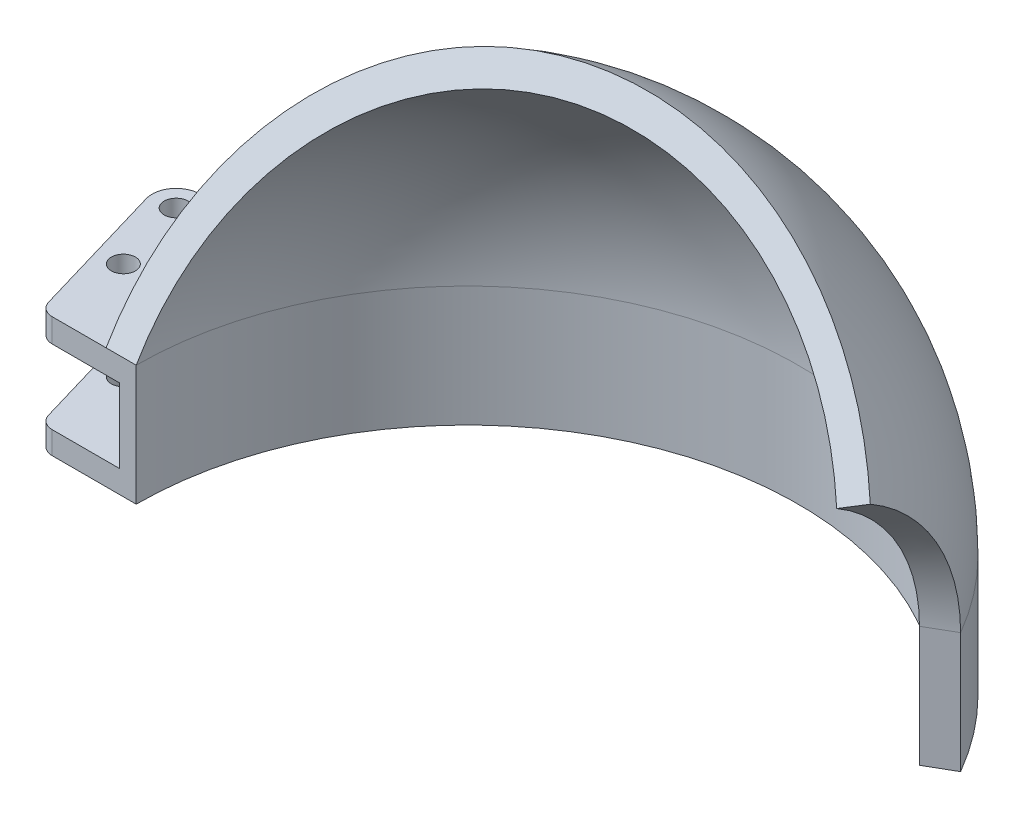
ISO-10303-21;
HEADER;
FILE_DESCRIPTION(('STEP AP214'),'2;1');
FILE_NAME('part.step','',(''),(''),'','','');
FILE_SCHEMA(('AUTOMOTIVE_DESIGN { 1 0 10303 214 1 1 1 1 }'));
ENDSEC;
DATA;
#1=APPLICATION_CONTEXT('core data for automotive mechanical design processes');
#2=APPLICATION_PROTOCOL_DEFINITION('international standard','automotive_design',2000,#1);
#3=PRODUCT_CONTEXT('',#1,'mechanical');
#4=PRODUCT('Part','Part','',(#3));
#5=PRODUCT_RELATED_PRODUCT_CATEGORY('part','',(#4));
#6=PRODUCT_DEFINITION_FORMATION('','',#4);
#7=PRODUCT_DEFINITION_CONTEXT('part definition',#1,'design');
#8=PRODUCT_DEFINITION('design','',#6,#7);
#9=PRODUCT_DEFINITION_SHAPE('','',#8);
#10=(LENGTH_UNIT() NAMED_UNIT(*) SI_UNIT(.MILLI.,.METRE.));
#11=(NAMED_UNIT(*) PLANE_ANGLE_UNIT() SI_UNIT($,.RADIAN.));
#12=(NAMED_UNIT(*) SI_UNIT($,.STERADIAN.) SOLID_ANGLE_UNIT());
#13=UNCERTAINTY_MEASURE_WITH_UNIT(LENGTH_MEASURE(1.E-05),#10,'distance_accuracy_value','');
#14=(GEOMETRIC_REPRESENTATION_CONTEXT(3) GLOBAL_UNCERTAINTY_ASSIGNED_CONTEXT((#13)) GLOBAL_UNIT_ASSIGNED_CONTEXT((#10,
#11,#12)) REPRESENTATION_CONTEXT('',''));
#15=CARTESIAN_POINT('',(0.,0.,0.));
#16=DIRECTION('',(0.,0.,1.));
#17=DIRECTION('',(1.,0.,0.));
#18=AXIS2_PLACEMENT_3D('',#15,#16,#17);
#19=CARTESIAN_POINT('',(-90.8718083904622,48.4997111829199,62.4645525043412));
#20=DIRECTION('',(0.959186051498703,0.,-0.282775739076619));
#21=DIRECTION('',(-0.282775739076619,0.,-0.959186051498703));
#22=AXIS2_PLACEMENT_3D('',#19,#20,#21);
#23=PLANE('',#22);
#24=DIRECTION('',(0.282775739076619,0.,0.959186051498703));
#25=VECTOR('',#24,1.);
#26=CARTESIAN_POINT('',(-100.548050523299,80.6356119656842,29.6423715242877));
#27=LINE('',#26,#25);
#28=CARTESIAN_POINT('',(-90.8718083904623,80.6356119656842,62.4645525043412));
#29=VERTEX_POINT('',#28);
#30=CARTESIAN_POINT('',(-77.3042502359662,80.6356119656842,108.486225287111));
#31=VERTEX_POINT('',#30);
#32=EDGE_CURVE('E252',#29,#31,#27,.T.);
#33=ORIENTED_EDGE('',*,*,#32,.T.);
#34=DIRECTION('',(0.,-1.,0.));
#35=VECTOR('',#34,1.);
#36=CARTESIAN_POINT('',(-77.3042502359661,48.4997111829199,108.486225287111));
#37=LINE('',#36,#35);
#38=CARTESIAN_POINT('',(-77.3042502359661,88.4997111829199,108.486225287111));
#39=VERTEX_POINT('',#38);
#40=EDGE_CURVE('E197',#39,#31,#37,.T.);
#41=ORIENTED_EDGE('',*,*,#40,.F.);
#42=DIRECTION('',(0.282775739076619,0.,0.959186051498703));
#43=VECTOR('',#42,1.);
#44=CARTESIAN_POINT('',(-100.548050523299,88.4997111829199,29.6423715242877));
#45=LINE('',#44,#43);
#46=CARTESIAN_POINT('',(-90.8718083904622,88.4997111829199,62.4645525043412));
#47=VERTEX_POINT('',#46);
#48=EDGE_CURVE('E145',#47,#39,#45,.T.);
#49=ORIENTED_EDGE('',*,*,#48,.F.);
#50=DIRECTION('',(0.,-1.,0.));
#51=VECTOR('',#50,1.);
#52=CARTESIAN_POINT('',(-90.8718083904622,48.4997111829199,62.4645525043412));
#53=LINE('',#52,#51);
#54=EDGE_CURVE('E179',#47,#29,#53,.T.);
#55=ORIENTED_EDGE('',*,*,#54,.T.);
#56=EDGE_LOOP('',(#33,#41,#49,#55));
#57=FACE_BOUND('',#56,.T.);
#58=ADVANCED_FACE('F49',(#57),#23,.F.);
#59=CARTESIAN_POINT('',(-72.5083199784726,48.4997111829199,107.072346591728));
#60=DIRECTION('',(0.,-1.,0.));
#61=DIRECTION('',(0.,0.,-1.));
#62=AXIS2_PLACEMENT_3D('',#59,#60,#61);
#63=CYLINDRICAL_SURFACE('',#62,5.);
#64=CARTESIAN_POINT('',(-72.5083199784726,80.6356119656842,107.072346591728));
#65=DIRECTION('',(0.,-1.,0.));
#66=DIRECTION('',(0.,0.,-1.));
#67=AXIS2_PLACEMENT_3D('',#64,#65,#66);
#68=CIRCLE('',#67,5.);
#69=CARTESIAN_POINT('',(-72.5083199784726,80.6356119656842,112.072346591728));
#70=VERTEX_POINT('',#69);
#71=EDGE_CURVE('E127',#70,#31,#68,.T.);
#72=ORIENTED_EDGE('',*,*,#71,.F.);
#73=DIRECTION('',(0.,-1.,0.));
#74=VECTOR('',#73,1.);
#75=CARTESIAN_POINT('',(-72.5083199784726,48.4997111829199,112.072346591728));
#76=LINE('',#75,#74);
#77=CARTESIAN_POINT('',(-72.5083199784726,88.4997111829199,112.072346591728));
#78=VERTEX_POINT('',#77);
#79=EDGE_CURVE('E120',#78,#70,#76,.T.);
#80=ORIENTED_EDGE('',*,*,#79,.F.);
#81=CARTESIAN_POINT('',(-72.5083199784726,88.4997111829199,107.072346591728));
#82=DIRECTION('',(0.,1.,0.));
#83=DIRECTION('',(0.,0.,1.));
#84=AXIS2_PLACEMENT_3D('',#81,#82,#83);
#85=CIRCLE('',#84,5.);
#86=EDGE_CURVE('E124',#39,#78,#85,.T.);
#87=ORIENTED_EDGE('',*,*,#86,.F.);
#88=ORIENTED_EDGE('',*,*,#40,.T.);
#89=EDGE_LOOP('',(#72,#80,#87,#88));
#90=FACE_BOUND('',#89,.T.);
#91=ADVANCED_FACE('F122',(#90),#63,.T.);
#92=CARTESIAN_POINT('',(-83.1983199784726,48.4997111829199,60.2023465917282));
#93=DIRECTION('',(0.,-1.,0.));
#94=DIRECTION('',(0.,0.,-1.));
#95=AXIS2_PLACEMENT_3D('',#92,#93,#94);
#96=CYLINDRICAL_SURFACE('',#95,4.);
#97=CARTESIAN_POINT('',(-83.1983199784726,88.4997111829199,60.2023465917282));
#98=DIRECTION('',(0.,1.,0.));
#99=DIRECTION('',(0.,0.,1.));
#100=AXIS2_PLACEMENT_3D('',#97,#98,#99);
#101=CIRCLE('',#100,4.);
#102=CARTESIAN_POINT('',(-83.1983199784726,88.4997111829199,64.2023465917282));
#103=VERTEX_POINT('',#102);
#104=EDGE_CURVE('E155',#103,#103,#101,.F.);
#105=ORIENTED_EDGE('',*,*,#104,.F.);
#106=EDGE_LOOP('',(#105));
#107=FACE_BOUND('',#106,.T.);
#108=CARTESIAN_POINT('',(-83.1983199784726,80.6356119656842,60.2023465917282));
#109=DIRECTION('',(0.,-1.,0.));
#110=DIRECTION('',(0.,0.,-1.));
#111=AXIS2_PLACEMENT_3D('',#108,#109,#110);
#112=CIRCLE('',#111,4.);
#113=CARTESIAN_POINT('',(-83.1983199784726,80.6356119656842,56.2023465917282));
#114=VERTEX_POINT('',#113);
#115=EDGE_CURVE('E287',#114,#114,#112,.T.);
#116=ORIENTED_EDGE('',*,*,#115,.T.);
#117=EDGE_LOOP('',(#116));
#118=FACE_BOUND('',#117,.T.);
#119=ADVANCED_FACE('F385',(#107,#118),#96,.F.);
#120=CARTESIAN_POINT('',(-75.8683199784726,48.4997111829199,85.0723465917282));
#121=DIRECTION('',(0.,-1.,0.));
#122=DIRECTION('',(0.,0.,-1.));
#123=AXIS2_PLACEMENT_3D('',#120,#121,#122);
#124=CYLINDRICAL_SURFACE('',#123,4.);
#125=CARTESIAN_POINT('',(-75.8683199784726,88.4997111829199,85.0723465917282));
#126=DIRECTION('',(0.,1.,0.));
#127=DIRECTION('',(0.,0.,1.));
#128=AXIS2_PLACEMENT_3D('',#125,#126,#127);
#129=CIRCLE('',#128,4.);
#130=CARTESIAN_POINT('',(-75.8683199784726,88.4997111829199,89.0723465917282));
#131=VERTEX_POINT('',#130);
#132=EDGE_CURVE('E162',#131,#131,#129,.F.);
#133=ORIENTED_EDGE('',*,*,#132,.F.);
#134=EDGE_LOOP('',(#133));
#135=FACE_BOUND('',#134,.T.);
#136=CARTESIAN_POINT('',(-75.8683199784726,80.6356119656842,85.0723465917282));
#137=DIRECTION('',(0.,-1.,0.));
#138=DIRECTION('',(0.,0.,-1.));
#139=AXIS2_PLACEMENT_3D('',#136,#137,#138);
#140=CIRCLE('',#139,4.);
#141=CARTESIAN_POINT('',(-75.8683199784726,80.6356119656842,81.0723465917282));
#142=VERTEX_POINT('',#141);
#143=EDGE_CURVE('E283',#142,#142,#140,.T.);
#144=ORIENTED_EDGE('',*,*,#143,.T.);
#145=EDGE_LOOP('',(#144));
#146=FACE_BOUND('',#145,.T.);
#147=ADVANCED_FACE('F402',(#135,#146),#124,.F.);
#148=CARTESIAN_POINT('',(-83.1983199784726,48.4997111829199,60.2023465917282));
#149=DIRECTION('',(0.,-1.,0.));
#150=DIRECTION('',(0.,0.,-1.));
#151=AXIS2_PLACEMENT_3D('',#148,#149,#150);
#152=CYLINDRICAL_SURFACE('',#151,8.);
#153=CARTESIAN_POINT('',(-83.1983199784726,80.6356119656842,60.2023465917282));
#154=DIRECTION('',(0.,-1.,0.));
#155=DIRECTION('',(0.,0.,-1.));
#156=AXIS2_PLACEMENT_3D('',#153,#154,#155);
#157=CIRCLE('',#156,8.);
#158=CARTESIAN_POINT('',(-80.4349878468603,80.6356119656842,52.6947507361697));
#159=VERTEX_POINT('',#158);
#160=EDGE_CURVE('E223',#29,#159,#157,.T.);
#161=ORIENTED_EDGE('',*,*,#160,.F.);
#162=ORIENTED_EDGE('',*,*,#54,.F.);
#163=CARTESIAN_POINT('',(-83.1983199784726,88.4997111829199,60.2023465917282));
#164=DIRECTION('',(0.,1.,0.));
#165=DIRECTION('',(0.,0.,1.));
#166=AXIS2_PLACEMENT_3D('',#163,#164,#165);
#167=CIRCLE('',#166,8.);
#168=CARTESIAN_POINT('',(-80.4349878468602,88.4997111829199,52.6947507361698));
#169=VERTEX_POINT('',#168);
#170=EDGE_CURVE('E326',#169,#47,#167,.T.);
#171=ORIENTED_EDGE('',*,*,#170,.F.);
#172=DIRECTION('',(0.,-1.,0.));
#173=VECTOR('',#172,1.);
#174=CARTESIAN_POINT('',(-80.4349878468602,48.4997111829199,52.6947507361698));
#175=LINE('',#174,#173);
#176=EDGE_CURVE('E193',#169,#159,#175,.T.);
#177=ORIENTED_EDGE('',*,*,#176,.T.);
#178=EDGE_LOOP('',(#161,#162,#171,#177));
#179=FACE_BOUND('',#178,.T.);
#180=ADVANCED_FACE('F409',(#179),#152,.T.);
#181=CARTESIAN_POINT('',(-72.5083199784726,48.4997111829199,112.072346591728));
#182=DIRECTION('',(0.,0.,-1.));
#183=DIRECTION('',(-1.,0.,0.));
#184=AXIS2_PLACEMENT_3D('',#181,#182,#183);
#185=PLANE('',#184);
#186=DIRECTION('',(-1.,0.,0.));
#187=VECTOR('',#186,1.);
#188=CARTESIAN_POINT('',(-72.5083199784726,80.6356119656842,112.072346591728));
#189=LINE('',#188,#187);
#190=CARTESIAN_POINT('',(-50.1832677511967,80.6356119656842,112.072346591728));
#191=VERTEX_POINT('',#190);
#192=EDGE_CURVE('E278',#191,#70,#189,.T.);
#193=ORIENTED_EDGE('',*,*,#192,.F.);
#194=DIRECTION('',(0.,1.,0.));
#195=VECTOR('',#194,1.);
#196=CARTESIAN_POINT('',(-50.1832677511968,48.4997111829199,112.072346591728));
#197=LINE('',#196,#195);
#198=CARTESIAN_POINT('',(-50.1832677511967,55.9997111829199,112.072346591728));
#199=VERTEX_POINT('',#198);
#200=EDGE_CURVE('E242',#199,#191,#197,.T.);
#201=ORIENTED_EDGE('',*,*,#200,.F.);
#202=DIRECTION('',(-1.,0.,0.));
#203=VECTOR('',#202,1.);
#204=CARTESIAN_POINT('',(-72.5083199784726,55.9997111829199,112.072346591728));
#205=LINE('',#204,#203);
#206=CARTESIAN_POINT('',(-72.5083199784726,55.9997111829199,112.072346591728));
#207=VERTEX_POINT('',#206);
#208=EDGE_CURVE('E240',#199,#207,#205,.T.);
#209=ORIENTED_EDGE('',*,*,#208,.T.);
#210=CARTESIAN_POINT('',(-72.5083199784726,48.4997111829199,112.072346591728));
#211=VERTEX_POINT('',#210);
#212=EDGE_CURVE('E133',#207,#211,#76,.T.);
#213=ORIENTED_EDGE('',*,*,#212,.T.);
#214=DIRECTION('',(-1.,0.,0.));
#215=VECTOR('',#214,1.);
#216=CARTESIAN_POINT('',(-44.6131129359855,48.4997111829199,112.072346591728));
#217=LINE('',#216,#215);
#218=CARTESIAN_POINT('',(-44.6131129359855,48.4997111829199,112.072346591728));
#219=VERTEX_POINT('',#218);
#220=EDGE_CURVE('E298',#219,#211,#217,.T.);
#221=ORIENTED_EDGE('',*,*,#220,.F.);
#222=DIRECTION('',(0.,-1.,0.));
#223=VECTOR('',#222,1.);
#224=CARTESIAN_POINT('',(-44.6131129359855,88.4997111829199,112.072346591728));
#225=LINE('',#224,#223);
#226=CARTESIAN_POINT('',(-44.6131129359855,88.4997111829199,112.072346591728));
#227=VERTEX_POINT('',#226);
#228=EDGE_CURVE('E182',#227,#219,#225,.T.);
#229=ORIENTED_EDGE('',*,*,#228,.F.);
#230=DIRECTION('',(1.,0.,0.));
#231=VECTOR('',#230,1.);
#232=CARTESIAN_POINT('',(0.,88.4997111829199,112.072346591728));
#233=LINE('',#232,#231);
#234=CARTESIAN_POINT('',(-54.6131129359855,88.4997111829199,112.072346591728));
#235=VERTEX_POINT('',#234);
#236=EDGE_CURVE('E150',#235,#227,#233,.T.);
#237=ORIENTED_EDGE('',*,*,#236,.F.);
#238=DIRECTION('',(1.,0.,0.));
#239=VECTOR('',#238,1.);
#240=CARTESIAN_POINT('',(0.,88.4997111829199,112.072346591728));
#241=LINE('',#240,#239);
#242=EDGE_CURVE('E141',#78,#235,#241,.T.);
#243=ORIENTED_EDGE('',*,*,#242,.F.);
#244=ORIENTED_EDGE('',*,*,#79,.T.);
#245=EDGE_LOOP('',(#193,#201,#209,#213,#221,#229,#237,#243,#244));
#246=FACE_BOUND('',#245,.T.);
#247=ADVANCED_FACE('F148',(#246),#185,.F.);
#248=CARTESIAN_POINT('',(37.7087626037851,48.4997111829199,96.1800991820042));
#249=DIRECTION('',(-0.345416516451547,0.,0.938449481944808));
#250=DIRECTION('',(0.938449481944808,0.,0.345416516451547));
#251=AXIS2_PLACEMENT_3D('',#248,#249,#250);
#252=PLANE('',#251);
#253=DIRECTION('',(0.938449481944808,0.,0.345416516451547));
#254=VECTOR('',#253,1.);
#255=CARTESIAN_POINT('',(37.7087626037851,80.6356119656842,96.1800991820042));
#256=LINE('',#255,#254);
#257=CARTESIAN_POINT('',(-66.1367512945611,80.6356119656842,57.957524232576));
#258=VERTEX_POINT('',#257);
#259=EDGE_CURVE('E53',#159,#258,#256,.T.);
#260=ORIENTED_EDGE('',*,*,#259,.F.);
#261=ORIENTED_EDGE('',*,*,#176,.F.);
#262=DIRECTION('',(-0.938449481944808,0.,-0.345416516451547));
#263=VECTOR('',#262,1.);
#264=CARTESIAN_POINT('',(-26.6782221381886,88.4997111829199,72.4810845815577));
#265=LINE('',#264,#263);
#266=CARTESIAN_POINT('',(-45.2657064055788,88.4997111829199,65.6395612084141));
#267=VERTEX_POINT('',#266);
#268=EDGE_CURVE('E322',#267,#169,#265,.T.);
#269=ORIENTED_EDGE('',*,*,#268,.F.);
#270=DIRECTION('',(0.,-1.,0.));
#271=VECTOR('',#270,1.);
#272=CARTESIAN_POINT('',(-45.2657064055788,88.4997111829199,65.6395612084141));
#273=LINE('',#272,#271);
#274=CARTESIAN_POINT('',(-45.2657064055788,48.4997111829199,65.6395612084141));
#275=VERTEX_POINT('',#274);
#276=EDGE_CURVE('E185',#267,#275,#273,.T.);
#277=ORIENTED_EDGE('',*,*,#276,.T.);
#278=DIRECTION('',(0.938449481944808,0.,0.345416516451547));
#279=VECTOR('',#278,1.);
#280=CARTESIAN_POINT('',(-80.4349878468602,48.4997111829199,52.6947507361697));
#281=LINE('',#280,#279);
#282=CARTESIAN_POINT('',(-80.4349878468602,48.4997111829199,52.6947507361697));
#283=VERTEX_POINT('',#282);
#284=EDGE_CURVE('E295',#283,#275,#281,.T.);
#285=ORIENTED_EDGE('',*,*,#284,.F.);
#286=CARTESIAN_POINT('',(-80.4349878468603,55.9997111829199,52.6947507361697));
#287=VERTEX_POINT('',#286);
#288=EDGE_CURVE('E192',#287,#283,#175,.T.);
#289=ORIENTED_EDGE('',*,*,#288,.F.);
#290=DIRECTION('',(0.938449481944808,0.,0.345416516451547));
#291=VECTOR('',#290,1.);
#292=CARTESIAN_POINT('',(37.7087626037851,55.9997111829199,96.1800991820042));
#293=LINE('',#292,#291);
#294=CARTESIAN_POINT('',(-66.1367512945611,55.9997111829199,57.957524232576));
#295=VERTEX_POINT('',#294);
#296=EDGE_CURVE('E205',#287,#295,#293,.T.);
#297=ORIENTED_EDGE('',*,*,#296,.T.);
#298=DIRECTION('',(0.,-1.,0.));
#299=VECTOR('',#298,1.);
#300=CARTESIAN_POINT('',(-66.1367512945611,48.4997111829199,57.957524232576));
#301=LINE('',#300,#299);
#302=EDGE_CURVE('E178',#258,#295,#301,.T.);
#303=ORIENTED_EDGE('',*,*,#302,.F.);
#304=EDGE_LOOP('',(#260,#261,#269,#277,#285,#289,#297,#303));
#305=FACE_BOUND('',#304,.T.);
#306=ADVANCED_FACE('F224',(#305),#252,.F.);
#307=CARTESIAN_POINT('',(-77.3042502359662,55.9997111829199,108.486225287111));
#308=VERTEX_POINT('',#307);
#309=CARTESIAN_POINT('',(-77.3042502359661,48.4997111829199,108.486225287111));
#310=VERTEX_POINT('',#309);
#311=EDGE_CURVE('E132',#308,#310,#37,.T.);
#312=ORIENTED_EDGE('',*,*,#311,.F.);
#313=DIRECTION('',(0.282775739076619,0.,0.959186051498703));
#314=VECTOR('',#313,1.);
#315=CARTESIAN_POINT('',(-100.548050523299,55.9997111829199,29.6423715242877));
#316=LINE('',#315,#314);
#317=CARTESIAN_POINT('',(-90.8718083904623,55.9997111829199,62.4645525043412));
#318=VERTEX_POINT('',#317);
#319=EDGE_CURVE('E248',#318,#308,#316,.T.);
#320=ORIENTED_EDGE('',*,*,#319,.F.);
#321=CARTESIAN_POINT('',(-90.8718083904622,48.4997111829199,62.4645525043412));
#322=VERTEX_POINT('',#321);
#323=EDGE_CURVE('E200',#318,#322,#53,.T.);
#324=ORIENTED_EDGE('',*,*,#323,.T.);
#325=DIRECTION('',(-0.282775739076619,0.,-0.959186051498703));
#326=VECTOR('',#325,1.);
#327=CARTESIAN_POINT('',(-77.3042502359661,48.4997111829199,108.486225287111));
#328=LINE('',#327,#326);
#329=EDGE_CURVE('E306',#310,#322,#328,.T.);
#330=ORIENTED_EDGE('',*,*,#329,.F.);
#331=EDGE_LOOP('',(#312,#320,#324,#330));
#332=FACE_BOUND('',#331,.T.);
#333=ADVANCED_FACE('F359',(#332),#23,.F.);
#334=ORIENTED_EDGE('',*,*,#212,.F.);
#335=CARTESIAN_POINT('',(-72.5083199784726,55.9997111829199,107.072346591728));
#336=DIRECTION('',(0.,-1.,0.));
#337=DIRECTION('',(0.,0.,-1.));
#338=AXIS2_PLACEMENT_3D('',#335,#336,#337);
#339=CIRCLE('',#338,5.);
#340=EDGE_CURVE('E264',#207,#308,#339,.T.);
#341=ORIENTED_EDGE('',*,*,#340,.T.);
#342=ORIENTED_EDGE('',*,*,#311,.T.);
#343=CARTESIAN_POINT('',(-72.5083199784726,48.4997111829199,107.072346591728));
#344=DIRECTION('',(0.,-1.,0.));
#345=DIRECTION('',(0.,0.,-1.));
#346=AXIS2_PLACEMENT_3D('',#343,#344,#345);
#347=CIRCLE('',#346,5.00000000000001);
#348=EDGE_CURVE('E302',#211,#310,#347,.T.);
#349=ORIENTED_EDGE('',*,*,#348,.F.);
#350=EDGE_LOOP('',(#334,#341,#342,#349));
#351=FACE_BOUND('',#350,.T.);
#352=ADVANCED_FACE('F374',(#351),#63,.T.);
#353=CARTESIAN_POINT('',(-83.1983199784726,55.9997111829199,60.2023465917282));
#354=DIRECTION('',(0.,-1.,0.));
#355=DIRECTION('',(0.,0.,-1.));
#356=AXIS2_PLACEMENT_3D('',#353,#354,#355);
#357=CIRCLE('',#356,4.);
#358=CARTESIAN_POINT('',(-83.1983199784726,55.9997111829199,56.2023465917282));
#359=VERTEX_POINT('',#358);
#360=EDGE_CURVE('E272',#359,#359,#357,.T.);
#361=ORIENTED_EDGE('',*,*,#360,.F.);
#362=EDGE_LOOP('',(#361));
#363=FACE_BOUND('',#362,.T.);
#364=CARTESIAN_POINT('',(-83.1983199784726,48.4997111829199,60.2023465917282));
#365=DIRECTION('',(0.,-1.,0.));
#366=DIRECTION('',(0.,0.,-1.));
#367=AXIS2_PLACEMENT_3D('',#364,#365,#366);
#368=CIRCLE('',#367,4.);
#369=CARTESIAN_POINT('',(-83.1983199784726,48.4997111829199,56.2023465917282));
#370=VERTEX_POINT('',#369);
#371=EDGE_CURVE('E171',#370,#370,#368,.T.);
#372=ORIENTED_EDGE('',*,*,#371,.T.);
#373=EDGE_LOOP('',(#372));
#374=FACE_BOUND('',#373,.T.);
#375=ADVANCED_FACE('F376',(#363,#374),#96,.F.);
#376=CARTESIAN_POINT('',(-75.8683199784726,55.9997111829199,85.0723465917282));
#377=DIRECTION('',(0.,-1.,0.));
#378=DIRECTION('',(0.,0.,-1.));
#379=AXIS2_PLACEMENT_3D('',#376,#377,#378);
#380=CIRCLE('',#379,4.);
#381=CARTESIAN_POINT('',(-75.8683199784726,55.9997111829199,81.0723465917282));
#382=VERTEX_POINT('',#381);
#383=EDGE_CURVE('E268',#382,#382,#380,.T.);
#384=ORIENTED_EDGE('',*,*,#383,.F.);
#385=EDGE_LOOP('',(#384));
#386=FACE_BOUND('',#385,.T.);
#387=CARTESIAN_POINT('',(-75.8683199784726,48.4997111829199,85.0723465917282));
#388=DIRECTION('',(0.,-1.,0.));
#389=DIRECTION('',(0.,0.,-1.));
#390=AXIS2_PLACEMENT_3D('',#387,#388,#389);
#391=CIRCLE('',#390,4.);
#392=CARTESIAN_POINT('',(-75.8683199784726,48.4997111829199,81.0723465917282));
#393=VERTEX_POINT('',#392);
#394=EDGE_CURVE('E310',#393,#393,#391,.T.);
#395=ORIENTED_EDGE('',*,*,#394,.T.);
#396=EDGE_LOOP('',(#395));
#397=FACE_BOUND('',#396,.T.);
#398=ADVANCED_FACE('F382',(#386,#397),#124,.F.);
#399=ORIENTED_EDGE('',*,*,#323,.F.);
#400=CARTESIAN_POINT('',(-83.1983199784726,55.9997111829199,60.2023465917282));
#401=DIRECTION('',(0.,-1.,0.));
#402=DIRECTION('',(0.,0.,-1.));
#403=AXIS2_PLACEMENT_3D('',#400,#401,#402);
#404=CIRCLE('',#403,8.);
#405=EDGE_CURVE('E246',#318,#287,#404,.T.);
#406=ORIENTED_EDGE('',*,*,#405,.T.);
#407=ORIENTED_EDGE('',*,*,#288,.T.);
#408=CARTESIAN_POINT('',(-83.1983199784726,48.4997111829199,60.2023465917282));
#409=DIRECTION('',(0.,-1.,0.));
#410=DIRECTION('',(0.,0.,-1.));
#411=AXIS2_PLACEMENT_3D('',#408,#409,#410);
#412=CIRCLE('',#411,8.00000000000001);
#413=EDGE_CURVE('E291',#322,#283,#412,.T.);
#414=ORIENTED_EDGE('',*,*,#413,.F.);
#415=EDGE_LOOP('',(#399,#406,#407,#414));
#416=FACE_BOUND('',#415,.T.);
#417=ADVANCED_FACE('F51',(#416),#152,.T.);
#418=CARTESIAN_POINT('',(64.8754713710893,88.4997111829199,112.367612579706));
#419=DIRECTION('',(-0.500000000000001,0.,-0.866025403784438));
#420=DIRECTION('',(-0.866025403784438,0.,0.500000000000001));
#421=AXIS2_PLACEMENT_3D('',#418,#419,#420);
#422=PLANE('',#421);
#423=DIRECTION('',(0.866025403784438,0.,-0.500000000000001));
#424=VECTOR('',#423,1.);
#425=CARTESIAN_POINT('',(64.8754713710893,48.4997111829199,112.367612579706));
#426=LINE('',#425,#424);
#427=CARTESIAN_POINT('',(160.649681480303,48.4997111829199,57.0723465917281));
#428=VERTEX_POINT('',#427);
#429=CARTESIAN_POINT('',(169.309935518147,48.4997111829199,52.0723465917281));
#430=VERTEX_POINT('',#429);
#431=EDGE_CURVE('E166',#428,#430,#426,.T.);
#432=ORIENTED_EDGE('',*,*,#431,.T.);
#433=DIRECTION('',(0.,-1.,0.));
#434=VECTOR('',#433,1.);
#435=CARTESIAN_POINT('',(169.309935518147,88.4997111829199,52.0723465917281));
#436=LINE('',#435,#434);
#437=CARTESIAN_POINT('',(169.309935518147,88.4997111829199,52.0723465917281));
#438=VERTEX_POINT('',#437);
#439=EDGE_CURVE('E189',#438,#430,#436,.T.);
#440=ORIENTED_EDGE('',*,*,#439,.F.);
#441=DIRECTION('',(0.866025403784438,0.,-0.500000000000001));
#442=VECTOR('',#441,1.);
#443=CARTESIAN_POINT('',(64.8754713710893,88.4997111829199,112.367612579706));
#444=LINE('',#443,#442);
#445=CARTESIAN_POINT('',(160.649681480303,88.4997111829199,57.0723465917281));
#446=VERTEX_POINT('',#445);
#447=EDGE_CURVE('E175',#446,#438,#444,.T.);
#448=ORIENTED_EDGE('',*,*,#447,.F.);
#449=DIRECTION('',(0.,-1.,0.));
#450=VECTOR('',#449,1.);
#451=CARTESIAN_POINT('',(160.649681480303,88.4997111829199,57.0723465917281));
#452=LINE('',#451,#450);
#453=EDGE_CURVE('E75',#446,#428,#452,.T.);
#454=ORIENTED_EDGE('',*,*,#453,.T.);
#455=EDGE_LOOP('',(#432,#440,#448,#454));
#456=FACE_BOUND('',#455,.T.);
#457=ADVANCED_FACE('F461',(#456),#422,.F.);
#458=CARTESIAN_POINT('',(65.3868870640145,88.4997111829199,112.072346591728));
#459=DIRECTION('',(0.,-1.,0.));
#460=DIRECTION('',(0.,0.,-1.));
#461=AXIS2_PLACEMENT_3D('',#458,#459,#460);
#462=CYLINDRICAL_SURFACE('',#461,120.);
#463=CARTESIAN_POINT('',(65.3868870640145,48.4997111829199,112.072346591728));
#464=DIRECTION('',(0.,1.,0.));
#465=DIRECTION('',(0.,0.,1.));
#466=AXIS2_PLACEMENT_3D('',#463,#464,#465);
#467=CIRCLE('',#466,120.);
#468=EDGE_CURVE('E170',#430,#275,#467,.T.);
#469=ORIENTED_EDGE('',*,*,#468,.T.);
#470=ORIENTED_EDGE('',*,*,#276,.F.);
#471=CARTESIAN_POINT('',(65.3868870640145,88.4997111829199,112.072346591728));
#472=DIRECTION('',(0.,1.,0.));
#473=DIRECTION('',(0.,0.,1.));
#474=AXIS2_PLACEMENT_3D('',#471,#472,#473);
#475=CIRCLE('',#474,120.);
#476=EDGE_CURVE('E100',#438,#267,#475,.T.);
#477=ORIENTED_EDGE('',*,*,#476,.F.);
#478=ORIENTED_EDGE('',*,*,#439,.T.);
#479=EDGE_LOOP('',(#469,#470,#477,#478));
#480=FACE_BOUND('',#479,.T.);
#481=ADVANCED_FACE('F663',(#480),#462,.T.);
#482=CARTESIAN_POINT('',(65.3868870640145,88.4997111829199,112.072346591728));
#483=DIRECTION('',(0.,-1.,0.));
#484=DIRECTION('',(0.,0.,-1.));
#485=AXIS2_PLACEMENT_3D('',#482,#483,#484);
#486=CYLINDRICAL_SURFACE('',#485,110.);
#487=CARTESIAN_POINT('',(65.3868870640145,48.4997111829199,112.072346591728));
#488=DIRECTION('',(0.,1.,0.));
#489=DIRECTION('',(0.,0.,1.));
#490=AXIS2_PLACEMENT_3D('',#487,#488,#489);
#491=CIRCLE('',#490,110.);
#492=EDGE_CURVE('E92',#428,#219,#491,.T.);
#493=ORIENTED_EDGE('',*,*,#492,.F.);
#494=ORIENTED_EDGE('',*,*,#453,.F.);
#495=CARTESIAN_POINT('',(65.3868870640145,88.4997111829199,112.072346591728));
#496=DIRECTION('',(0.,1.,0.));
#497=DIRECTION('',(0.,0.,1.));
#498=AXIS2_PLACEMENT_3D('',#495,#496,#497);
#499=CIRCLE('',#498,110.);
#500=EDGE_CURVE('E152',#446,#227,#499,.T.);
#501=ORIENTED_EDGE('',*,*,#500,.T.);
#502=ORIENTED_EDGE('',*,*,#228,.T.);
#503=EDGE_LOOP('',(#493,#494,#501,#502));
#504=FACE_BOUND('',#503,.T.);
#505=ADVANCED_FACE('F656',(#504),#486,.F.);
#506=CARTESIAN_POINT('',(0.,88.4997111829199,0.));
#507=DIRECTION('',(0.,1.,0.));
#508=DIRECTION('',(0.,0.,1.));
#509=AXIS2_PLACEMENT_3D('',#506,#507,#508);
#510=PLANE('',#509);
#511=CARTESIAN_POINT('',(65.3868870640145,88.4997111829199,112.072346591728));
#512=DIRECTION('',(0.,1.,0.));
#513=DIRECTION('',(0.,0.,1.));
#514=AXIS2_PLACEMENT_3D('',#511,#512,#513);
#515=CIRCLE('',#514,120.);
#516=EDGE_CURVE('E11',#267,#235,#515,.T.);
#517=ORIENTED_EDGE('',*,*,#516,.F.);
#518=ORIENTED_EDGE('',*,*,#268,.T.);
#519=ORIENTED_EDGE('',*,*,#170,.T.);
#520=ORIENTED_EDGE('',*,*,#48,.T.);
#521=ORIENTED_EDGE('',*,*,#86,.T.);
#522=ORIENTED_EDGE('',*,*,#242,.T.);
#523=EDGE_LOOP('',(#517,#518,#519,#520,#521,#522));
#524=FACE_BOUND('',#523,.T.);
#525=ORIENTED_EDGE('',*,*,#104,.T.);
#526=EDGE_LOOP('',(#525));
#527=FACE_BOUND('',#526,.T.);
#528=ORIENTED_EDGE('',*,*,#132,.T.);
#529=EDGE_LOOP('',(#528));
#530=FACE_BOUND('',#529,.T.);
#531=ADVANCED_FACE('F138',(#524,#527,#530),#510,.T.);
#532=CARTESIAN_POINT('',(0.,48.4997111829199,0.));
#533=DIRECTION('',(0.,1.,0.));
#534=DIRECTION('',(0.,0.,1.));
#535=AXIS2_PLACEMENT_3D('',#532,#533,#534);
#536=PLANE('',#535);
#537=ORIENTED_EDGE('',*,*,#431,.F.);
#538=ORIENTED_EDGE('',*,*,#492,.T.);
#539=ORIENTED_EDGE('',*,*,#220,.T.);
#540=ORIENTED_EDGE('',*,*,#348,.T.);
#541=ORIENTED_EDGE('',*,*,#329,.T.);
#542=ORIENTED_EDGE('',*,*,#413,.T.);
#543=ORIENTED_EDGE('',*,*,#284,.T.);
#544=ORIENTED_EDGE('',*,*,#468,.F.);
#545=EDGE_LOOP('',(#537,#538,#539,#540,#541,#542,#543,#544));
#546=FACE_BOUND('',#545,.T.);
#547=ORIENTED_EDGE('',*,*,#371,.F.);
#548=EDGE_LOOP('',(#547));
#549=FACE_BOUND('',#548,.T.);
#550=ORIENTED_EDGE('',*,*,#394,.F.);
#551=EDGE_LOOP('',(#550));
#552=FACE_BOUND('',#551,.T.);
#553=ADVANCED_FACE('F366',(#546,#549,#552),#536,.F.);
#554=CARTESIAN_POINT('',(-76.5683992358316,80.6356119656842,22.5729780473723));
#555=DIRECTION('',(0.,-1.,0.));
#556=DIRECTION('',(0.,0.,-1.));
#557=AXIS2_PLACEMENT_3D('',#554,#555,#556);
#558=PLANE('',#557);
#559=ORIENTED_EDGE('',*,*,#115,.F.);
#560=EDGE_LOOP('',(#559));
#561=FACE_BOUND('',#560,.T.);
#562=ORIENTED_EDGE('',*,*,#143,.F.);
#563=EDGE_LOOP('',(#562));
#564=FACE_BOUND('',#563,.T.);
#565=ORIENTED_EDGE('',*,*,#71,.T.);
#566=ORIENTED_EDGE('',*,*,#32,.F.);
#567=ORIENTED_EDGE('',*,*,#160,.T.);
#568=ORIENTED_EDGE('',*,*,#259,.T.);
#569=DIRECTION('',(0.282775739076619,0.,0.959186051498703));
#570=VECTOR('',#569,1.);
#571=CARTESIAN_POINT('',(-76.5683992358316,80.6356119656842,22.5729780473723));
#572=LINE('',#571,#570);
#573=EDGE_CURVE('E66',#258,#191,#572,.T.);
#574=ORIENTED_EDGE('',*,*,#573,.T.);
#575=ORIENTED_EDGE('',*,*,#192,.T.);
#576=EDGE_LOOP('',(#565,#566,#567,#568,#574,#575));
#577=FACE_BOUND('',#576,.T.);
#578=ADVANCED_FACE('F217',(#561,#564,#577),#558,.T.);
#579=CARTESIAN_POINT('',(-76.5683992358316,55.9997111829199,22.5729780473723));
#580=DIRECTION('',(0.,-1.,0.));
#581=DIRECTION('',(0.,0.,-1.));
#582=AXIS2_PLACEMENT_3D('',#579,#580,#581);
#583=PLANE('',#582);
#584=ORIENTED_EDGE('',*,*,#360,.T.);
#585=EDGE_LOOP('',(#584));
#586=FACE_BOUND('',#585,.T.);
#587=ORIENTED_EDGE('',*,*,#383,.T.);
#588=EDGE_LOOP('',(#587));
#589=FACE_BOUND('',#588,.T.);
#590=ORIENTED_EDGE('',*,*,#208,.F.);
#591=DIRECTION('',(0.282775739076619,0.,0.959186051498703));
#592=VECTOR('',#591,1.);
#593=CARTESIAN_POINT('',(-76.5683992358316,55.9997111829199,22.5729780473723));
#594=LINE('',#593,#592);
#595=EDGE_CURVE('E229',#295,#199,#594,.T.);
#596=ORIENTED_EDGE('',*,*,#595,.F.);
#597=ORIENTED_EDGE('',*,*,#296,.F.);
#598=ORIENTED_EDGE('',*,*,#405,.F.);
#599=ORIENTED_EDGE('',*,*,#319,.T.);
#600=ORIENTED_EDGE('',*,*,#340,.F.);
#601=EDGE_LOOP('',(#590,#596,#597,#598,#599,#600));
#602=FACE_BOUND('',#601,.T.);
#603=ADVANCED_FACE('F234',(#586,#589,#602),#583,.F.);
#604=CARTESIAN_POINT('',(-76.5683992358316,0.,22.5729780473723));
#605=DIRECTION('',(-0.959186051498703,0.,0.282775739076619));
#606=DIRECTION('',(0.282775739076619,0.,0.959186051498703));
#607=AXIS2_PLACEMENT_3D('',#604,#605,#606);
#608=PLANE('',#607);
#609=ORIENTED_EDGE('',*,*,#200,.T.);
#610=ORIENTED_EDGE('',*,*,#573,.F.);
#611=ORIENTED_EDGE('',*,*,#302,.T.);
#612=ORIENTED_EDGE('',*,*,#595,.T.);
#613=EDGE_LOOP('',(#609,#610,#611,#612));
#614=FACE_BOUND('',#613,.T.);
#615=ADVANCED_FACE('F227',(#614),#608,.T.);
#616=CARTESIAN_POINT('',(65.3868870640145,88.4997111829199,112.072346591728));
#617=DIRECTION('',(-1.,0.,0.));
#618=DIRECTION('',(0.,0.86602540378444,-0.499999999999998));
#619=AXIS2_PLACEMENT_3D('',#616,#617,#618);
#620=SPHERICAL_SURFACE('',#619,120.);
#621=ORIENTED_EDGE('',*,*,#476,.T.);
#622=ORIENTED_EDGE('',*,*,#516,.T.);
#623=CARTESIAN_POINT('',(65.3868870640145,88.4997111829199,112.072346591728));
#624=DIRECTION('',(0.,0.499999999999998,0.86602540378444));
#625=DIRECTION('',(0.,-0.86602540378444,0.499999999999998));
#626=AXIS2_PLACEMENT_3D('',#623,#624,#625);
#627=CIRCLE('',#626,120.);
#628=CARTESIAN_POINT('',(169.309935518147,140.461235409986,82.0723465917282));
#629=VERTEX_POINT('',#628);
#630=EDGE_CURVE('E711',#629,#235,#627,.T.);
#631=ORIENTED_EDGE('',*,*,#630,.F.);
#632=CARTESIAN_POINT('',(169.309935518147,88.4997111829199,112.072346591728));
#633=DIRECTION('',(-1.,0.,0.));
#634=DIRECTION('',(0.,0.,1.));
#635=AXIS2_PLACEMENT_3D('',#632,#633,#634);
#636=CIRCLE('',#635,60.0000000000002);
#637=EDGE_CURVE('E709',#629,#438,#636,.T.);
#638=ORIENTED_EDGE('',*,*,#637,.T.);
#639=EDGE_LOOP('',(#621,#622,#631,#638));
#640=FACE_BOUND('',#639,.T.);
#641=ADVANCED_FACE('F491',(#640),#620,.T.);
#642=CARTESIAN_POINT('',(65.3868870640145,88.4997111829199,112.072346591728));
#643=DIRECTION('',(-1.,0.,0.));
#644=DIRECTION('',(0.,0.86602540378444,-0.499999999999998));
#645=AXIS2_PLACEMENT_3D('',#642,#643,#644);
#646=SPHERICAL_SURFACE('',#645,110.);
#647=CARTESIAN_POINT('',(160.649681480303,88.4997111829199,112.072346591728));
#648=DIRECTION('',(-1.,0.,0.));
#649=DIRECTION('',(0.,0.,1.));
#650=AXIS2_PLACEMENT_3D('',#647,#648,#649);
#651=CIRCLE('',#650,55.0000000000002);
#652=CARTESIAN_POINT('',(160.649681480303,136.131108391064,84.5723465917282));
#653=VERTEX_POINT('',#652);
#654=EDGE_CURVE('E256',#653,#446,#651,.T.);
#655=ORIENTED_EDGE('',*,*,#654,.F.);
#656=CARTESIAN_POINT('',(65.3868870640145,88.4997111829199,112.072346591728));
#657=DIRECTION('',(0.,0.499999999999998,0.86602540378444));
#658=DIRECTION('',(0.,-0.86602540378444,0.499999999999998));
#659=AXIS2_PLACEMENT_3D('',#656,#657,#658);
#660=CIRCLE('',#659,110.);
#661=EDGE_CURVE('E724',#227,#653,#660,.F.);
#662=ORIENTED_EDGE('',*,*,#661,.F.);
#663=ORIENTED_EDGE('',*,*,#500,.F.);
#664=EDGE_LOOP('',(#655,#662,#663));
#665=FACE_BOUND('',#664,.T.);
#666=ADVANCED_FACE('F502',(#665),#646,.F.);
#667=CARTESIAN_POINT('',(160.649681480303,88.4997111829199,112.072346591728));
#668=DIRECTION('',(1.,0.,0.));
#669=DIRECTION('',(0.,0.,-1.));
#670=AXIS2_PLACEMENT_3D('',#667,#668,#669);
#671=CONICAL_SURFACE('',#670,55.0000000000002,0.523598775598304);
#672=DIRECTION('',(0.866025403784438,0.433012701892221,-0.25));
#673=VECTOR('',#672,1.);
#674=CARTESIAN_POINT('',(64.8754713710893,88.2440033364573,112.219979585717));
#675=LINE('',#674,#673);
#676=EDGE_CURVE('E715',#653,#629,#675,.T.);
#677=ORIENTED_EDGE('',*,*,#676,.F.);
#678=ORIENTED_EDGE('',*,*,#654,.T.);
#679=ORIENTED_EDGE('',*,*,#447,.T.);
#680=ORIENTED_EDGE('',*,*,#637,.F.);
#681=EDGE_LOOP('',(#677,#678,#679,#680));
#682=FACE_BOUND('',#681,.T.);
#683=ADVANCED_FACE('F511',(#682),#671,.F.);
#684=CARTESIAN_POINT('',(0.,185.557210393091,56.0361732958643));
#685=DIRECTION('',(0.,0.499999999999998,0.86602540378444));
#686=DIRECTION('',(0.,-0.86602540378444,0.499999999999998));
#687=AXIS2_PLACEMENT_3D('',#684,#685,#686);
#688=PLANE('',#687);
#689=ORIENTED_EDGE('',*,*,#630,.T.);
#690=ORIENTED_EDGE('',*,*,#236,.T.);
#691=ORIENTED_EDGE('',*,*,#661,.T.);
#692=ORIENTED_EDGE('',*,*,#676,.T.);
#693=EDGE_LOOP('',(#689,#690,#691,#692));
#694=FACE_BOUND('',#693,.T.);
#695=ADVANCED_FACE('F519',(#694),#688,.T.);
#696=CLOSED_SHELL('',(#58,#91,#119,#147,#180,#247,#306,#333,#352,#375,#398,#417,#457,#481,#505,
#531,#553,#578,#603,#615,#641,#666,#683,#695));
#697=MANIFOLD_SOLID_BREP('B2',#696);
#698=ADVANCED_BREP_SHAPE_REPRESENTATION('',(#18,#697),#14);
#699=SHAPE_DEFINITION_REPRESENTATION(#9,#698);
ENDSEC;
END-ISO-10303-21;
